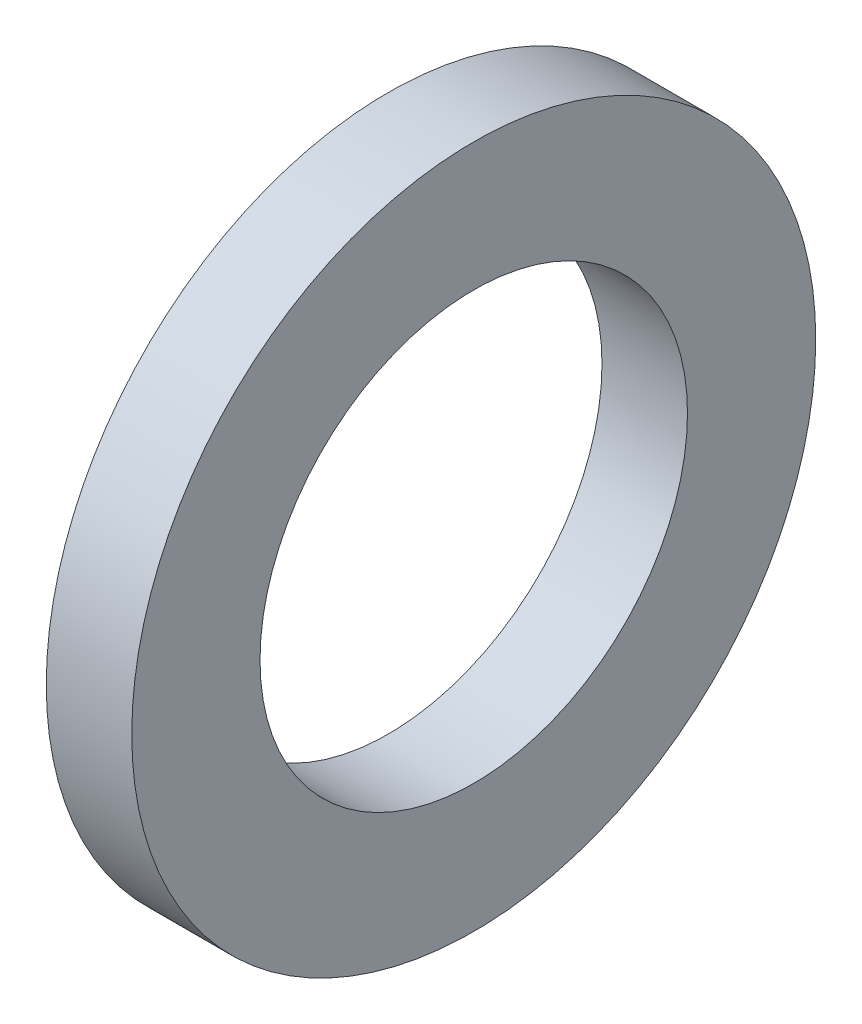
ISO-10303-21;
HEADER;
FILE_DESCRIPTION(('STEP AP214'),'2;1');
FILE_NAME('part.step','',(''),(''),'','','');
FILE_SCHEMA(('AUTOMOTIVE_DESIGN { 1 0 10303 214 1 1 1 1 }'));
ENDSEC;
DATA;
#1=APPLICATION_CONTEXT('core data for automotive mechanical design processes');
#2=APPLICATION_PROTOCOL_DEFINITION('international standard','automotive_design',2000,#1);
#3=PRODUCT_CONTEXT('',#1,'mechanical');
#4=PRODUCT('Part','Part','',(#3));
#5=PRODUCT_RELATED_PRODUCT_CATEGORY('part','',(#4));
#6=PRODUCT_DEFINITION_FORMATION('','',#4);
#7=PRODUCT_DEFINITION_CONTEXT('part definition',#1,'design');
#8=PRODUCT_DEFINITION('design','',#6,#7);
#9=PRODUCT_DEFINITION_SHAPE('','',#8);
#10=(LENGTH_UNIT() NAMED_UNIT(*) SI_UNIT(.MILLI.,.METRE.));
#11=(NAMED_UNIT(*) PLANE_ANGLE_UNIT() SI_UNIT($,.RADIAN.));
#12=(NAMED_UNIT(*) SI_UNIT($,.STERADIAN.) SOLID_ANGLE_UNIT());
#13=UNCERTAINTY_MEASURE_WITH_UNIT(LENGTH_MEASURE(1.E-05),#10,'distance_accuracy_value','');
#14=(GEOMETRIC_REPRESENTATION_CONTEXT(3) GLOBAL_UNCERTAINTY_ASSIGNED_CONTEXT((#13)) GLOBAL_UNIT_ASSIGNED_CONTEXT((#10,
#11,#12)) REPRESENTATION_CONTEXT('',''));
#15=CARTESIAN_POINT('',(0.,0.,0.));
#16=DIRECTION('',(0.,0.,1.));
#17=DIRECTION('',(1.,0.,0.));
#18=AXIS2_PLACEMENT_3D('',#15,#16,#17);
#19=CARTESIAN_POINT('',(0.75,0.,0.));
#20=DIRECTION('',(-1.,0.,0.));
#21=DIRECTION('',(0.,0.,1.));
#22=AXIS2_PLACEMENT_3D('',#19,#20,#21);
#23=CYLINDRICAL_SURFACE('',#22,6.);
#24=CARTESIAN_POINT('',(0.75,0.,0.));
#25=DIRECTION('',(1.,0.,0.));
#26=DIRECTION('',(0.,0.,-1.));
#27=AXIS2_PLACEMENT_3D('',#24,#25,#26);
#28=CIRCLE('',#27,6.);
#29=CARTESIAN_POINT('',(0.75,0.,-6.));
#30=VERTEX_POINT('',#29);
#31=EDGE_CURVE('E10',#30,#30,#28,.T.);
#32=ORIENTED_EDGE('',*,*,#31,.F.);
#33=EDGE_LOOP('',(#32));
#34=FACE_BOUND('',#33,.T.);
#35=CARTESIAN_POINT('',(-0.75,0.,0.));
#36=DIRECTION('',(1.,0.,0.));
#37=DIRECTION('',(0.,0.,-1.));
#38=AXIS2_PLACEMENT_3D('',#35,#36,#37);
#39=CIRCLE('',#38,6.);
#40=CARTESIAN_POINT('',(-0.75,0.,-6.));
#41=VERTEX_POINT('',#40);
#42=EDGE_CURVE('E46',#41,#41,#39,.T.);
#43=ORIENTED_EDGE('',*,*,#42,.T.);
#44=EDGE_LOOP('',(#43));
#45=FACE_BOUND('',#44,.T.);
#46=ADVANCED_FACE('F43',(#34,#45),#23,.T.);
#47=CARTESIAN_POINT('',(0.75,0.,0.));
#48=DIRECTION('',(1.,0.,0.));
#49=DIRECTION('',(0.,0.,-1.));
#50=AXIS2_PLACEMENT_3D('',#47,#48,#49);
#51=PLANE('',#50);
#52=CARTESIAN_POINT('',(0.75,0.,0.));
#53=DIRECTION('',(1.,0.,0.));
#54=DIRECTION('',(0.,0.,-1.));
#55=AXIS2_PLACEMENT_3D('',#52,#53,#54);
#56=CIRCLE('',#55,3.75);
#57=CARTESIAN_POINT('',(0.75,0.,-3.75));
#58=VERTEX_POINT('',#57);
#59=EDGE_CURVE('E55',#58,#58,#56,.T.);
#60=ORIENTED_EDGE('',*,*,#59,.F.);
#61=EDGE_LOOP('',(#60));
#62=FACE_BOUND('',#61,.T.);
#63=ORIENTED_EDGE('',*,*,#31,.T.);
#64=EDGE_LOOP('',(#63));
#65=FACE_BOUND('',#64,.T.);
#66=ADVANCED_FACE('F75',(#62,#65),#51,.T.);
#67=CARTESIAN_POINT('',(-0.75,0.,0.));
#68=DIRECTION('',(1.,0.,0.));
#69=DIRECTION('',(0.,0.,-1.));
#70=AXIS2_PLACEMENT_3D('',#67,#68,#69);
#71=PLANE('',#70);
#72=CARTESIAN_POINT('',(-0.75,0.,0.));
#73=DIRECTION('',(1.,0.,0.));
#74=DIRECTION('',(0.,0.,-1.));
#75=AXIS2_PLACEMENT_3D('',#72,#73,#74);
#76=CIRCLE('',#75,3.75);
#77=CARTESIAN_POINT('',(-0.75,0.,-3.75));
#78=VERTEX_POINT('',#77);
#79=EDGE_CURVE('E60',#78,#78,#76,.T.);
#80=ORIENTED_EDGE('',*,*,#79,.T.);
#81=EDGE_LOOP('',(#80));
#82=FACE_BOUND('',#81,.T.);
#83=ORIENTED_EDGE('',*,*,#42,.F.);
#84=EDGE_LOOP('',(#83));
#85=FACE_BOUND('',#84,.T.);
#86=ADVANCED_FACE('F65',(#82,#85),#71,.F.);
#87=CARTESIAN_POINT('',(-0.75,0.,0.));
#88=DIRECTION('',(1.,0.,0.));
#89=DIRECTION('',(0.,0.,-1.));
#90=AXIS2_PLACEMENT_3D('',#87,#88,#89);
#91=CYLINDRICAL_SURFACE('',#90,3.75);
#92=ORIENTED_EDGE('',*,*,#59,.T.);
#93=EDGE_LOOP('',(#92));
#94=FACE_BOUND('',#93,.T.);
#95=ORIENTED_EDGE('',*,*,#79,.F.);
#96=EDGE_LOOP('',(#95));
#97=FACE_BOUND('',#96,.T.);
#98=ADVANCED_FACE('F68',(#94,#97),#91,.F.);
#99=CLOSED_SHELL('',(#46,#66,#86,#98));
#100=MANIFOLD_SOLID_BREP('B2',#99);
#101=ADVANCED_BREP_SHAPE_REPRESENTATION('',(#18,#100),#14);
#102=SHAPE_DEFINITION_REPRESENTATION(#9,#101);
ENDSEC;
END-ISO-10303-21;
